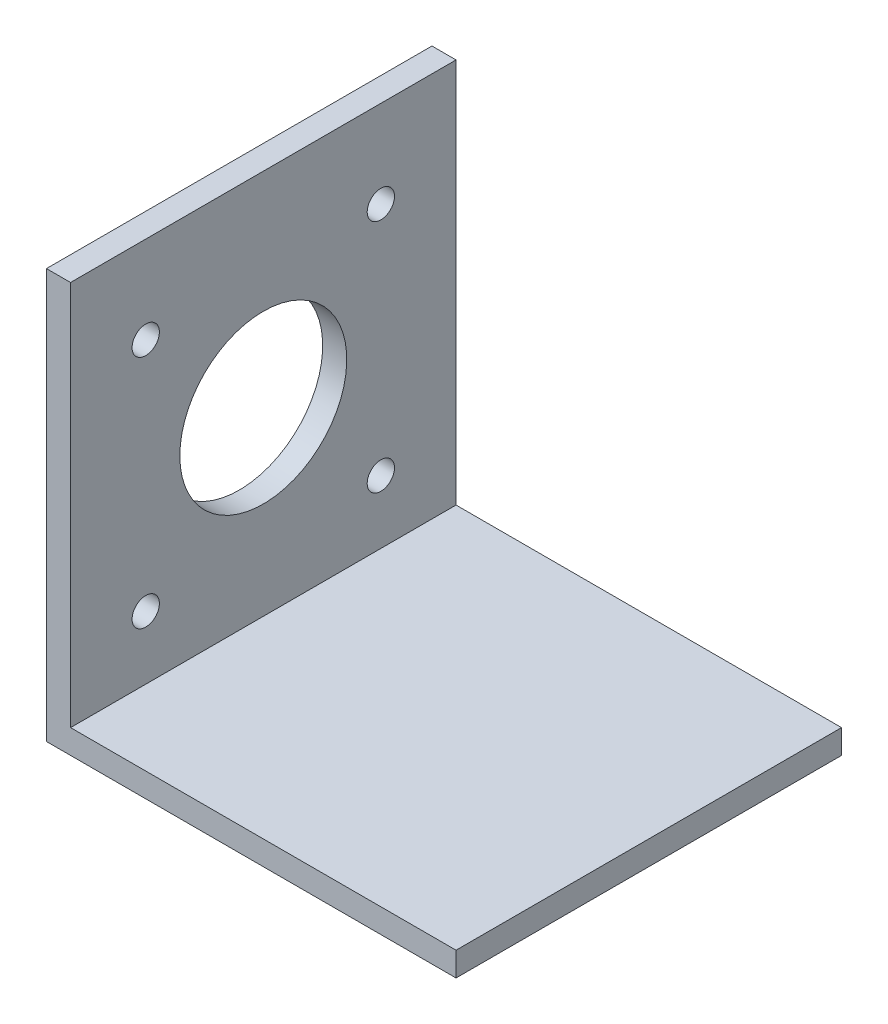
ISO-10303-21;
HEADER;
FILE_DESCRIPTION(('STEP AP214'),'2;1');
FILE_NAME('part.step','',(''),(''),'','','');
FILE_SCHEMA(('AUTOMOTIVE_DESIGN { 1 0 10303 214 1 1 1 1 }'));
ENDSEC;
DATA;
#1=APPLICATION_CONTEXT('core data for automotive mechanical design processes');
#2=APPLICATION_PROTOCOL_DEFINITION('international standard','automotive_design',2000,#1);
#3=PRODUCT_CONTEXT('',#1,'mechanical');
#4=PRODUCT('Part','Part','',(#3));
#5=PRODUCT_RELATED_PRODUCT_CATEGORY('part','',(#4));
#6=PRODUCT_DEFINITION_FORMATION('','',#4);
#7=PRODUCT_DEFINITION_CONTEXT('part definition',#1,'design');
#8=PRODUCT_DEFINITION('design','',#6,#7);
#9=PRODUCT_DEFINITION_SHAPE('','',#8);
#10=(LENGTH_UNIT() NAMED_UNIT(*) SI_UNIT(.MILLI.,.METRE.));
#11=(NAMED_UNIT(*) PLANE_ANGLE_UNIT() SI_UNIT($,.RADIAN.));
#12=(NAMED_UNIT(*) SI_UNIT($,.STERADIAN.) SOLID_ANGLE_UNIT());
#13=UNCERTAINTY_MEASURE_WITH_UNIT(LENGTH_MEASURE(1.E-05),#10,'distance_accuracy_value','');
#14=(GEOMETRIC_REPRESENTATION_CONTEXT(3) GLOBAL_UNCERTAINTY_ASSIGNED_CONTEXT((#13)) GLOBAL_UNIT_ASSIGNED_CONTEXT((#10,
#11,#12)) REPRESENTATION_CONTEXT('',''));
#15=CARTESIAN_POINT('',(0.,0.,0.));
#16=DIRECTION('',(0.,0.,1.));
#17=DIRECTION('',(1.,0.,0.));
#18=AXIS2_PLACEMENT_3D('',#15,#16,#17);
#19=CARTESIAN_POINT('',(0.,-3.175,50.8));
#20=DIRECTION('',(0.,1.,0.));
#21=DIRECTION('',(0.,0.,1.));
#22=AXIS2_PLACEMENT_3D('',#19,#20,#21);
#23=PLANE('',#22);
#24=DIRECTION('',(1.,0.,0.));
#25=VECTOR('',#24,1.);
#26=CARTESIAN_POINT('',(0.,-3.175,0.));
#27=LINE('',#26,#25);
#28=CARTESIAN_POINT('',(-3.17500000000001,-3.175,0.));
#29=VERTEX_POINT('',#28);
#30=CARTESIAN_POINT('',(50.8,-3.175,0.));
#31=VERTEX_POINT('',#30);
#32=EDGE_CURVE('E134',#29,#31,#27,.T.);
#33=ORIENTED_EDGE('',*,*,#32,.T.);
#34=DIRECTION('',(0.,0.,-1.));
#35=VECTOR('',#34,1.);
#36=CARTESIAN_POINT('',(50.8,-3.175,50.8));
#37=LINE('',#36,#35);
#38=CARTESIAN_POINT('',(50.8,-3.175,50.8));
#39=VERTEX_POINT('',#38);
#40=EDGE_CURVE('E13',#39,#31,#37,.T.);
#41=ORIENTED_EDGE('',*,*,#40,.F.);
#42=DIRECTION('',(1.,0.,0.));
#43=VECTOR('',#42,1.);
#44=CARTESIAN_POINT('',(0.,-3.175,50.8));
#45=LINE('',#44,#43);
#46=CARTESIAN_POINT('',(-3.17500000000001,-3.175,50.8));
#47=VERTEX_POINT('',#46);
#48=EDGE_CURVE('E99',#47,#39,#45,.T.);
#49=ORIENTED_EDGE('',*,*,#48,.F.);
#50=DIRECTION('',(0.,0.,-1.));
#51=VECTOR('',#50,1.);
#52=CARTESIAN_POINT('',(-3.17500000000001,-3.175,50.8));
#53=LINE('',#52,#51);
#54=EDGE_CURVE('E130',#47,#29,#53,.T.);
#55=ORIENTED_EDGE('',*,*,#54,.T.);
#56=EDGE_LOOP('',(#33,#41,#49,#55));
#57=FACE_BOUND('',#56,.T.);
#58=ADVANCED_FACE('F53',(#57),#23,.F.);
#59=CARTESIAN_POINT('',(50.8,0.,50.8));
#60=DIRECTION('',(1.,0.,0.));
#61=DIRECTION('',(0.,0.,-1.));
#62=AXIS2_PLACEMENT_3D('',#59,#60,#61);
#63=PLANE('',#62);
#64=DIRECTION('',(0.,-1.,0.));
#65=VECTOR('',#64,1.);
#66=CARTESIAN_POINT('',(50.8,0.,0.));
#67=LINE('',#66,#65);
#68=CARTESIAN_POINT('',(50.8,0.,0.));
#69=VERTEX_POINT('',#68);
#70=EDGE_CURVE('E137',#69,#31,#67,.T.);
#71=ORIENTED_EDGE('',*,*,#70,.F.);
#72=DIRECTION('',(0.,0.,-1.));
#73=VECTOR('',#72,1.);
#74=CARTESIAN_POINT('',(50.8,0.,50.8));
#75=LINE('',#74,#73);
#76=CARTESIAN_POINT('',(50.8,0.,50.8));
#77=VERTEX_POINT('',#76);
#78=EDGE_CURVE('E61',#77,#69,#75,.T.);
#79=ORIENTED_EDGE('',*,*,#78,.F.);
#80=DIRECTION('',(0.,-1.,0.));
#81=VECTOR('',#80,1.);
#82=CARTESIAN_POINT('',(50.8,0.,50.8));
#83=LINE('',#82,#81);
#84=EDGE_CURVE('E213',#77,#39,#83,.T.);
#85=ORIENTED_EDGE('',*,*,#84,.T.);
#86=ORIENTED_EDGE('',*,*,#40,.T.);
#87=EDGE_LOOP('',(#71,#79,#85,#86));
#88=FACE_BOUND('',#87,.T.);
#89=ADVANCED_FACE('F156',(#88),#63,.T.);
#90=CARTESIAN_POINT('',(0.,0.,50.8));
#91=DIRECTION('',(0.,1.,0.));
#92=DIRECTION('',(0.,0.,1.));
#93=AXIS2_PLACEMENT_3D('',#90,#91,#92);
#94=PLANE('',#93);
#95=DIRECTION('',(1.,0.,0.));
#96=VECTOR('',#95,1.);
#97=CARTESIAN_POINT('',(0.,0.,0.));
#98=LINE('',#97,#96);
#99=CARTESIAN_POINT('',(0.,0.,0.));
#100=VERTEX_POINT('',#99);
#101=EDGE_CURVE('E141',#100,#69,#98,.T.);
#102=ORIENTED_EDGE('',*,*,#101,.F.);
#103=DIRECTION('',(0.,0.,-1.));
#104=VECTOR('',#103,1.);
#105=CARTESIAN_POINT('',(0.,0.,50.8));
#106=LINE('',#105,#104);
#107=CARTESIAN_POINT('',(0.,0.,50.8));
#108=VERTEX_POINT('',#107);
#109=EDGE_CURVE('E120',#108,#100,#106,.T.);
#110=ORIENTED_EDGE('',*,*,#109,.F.);
#111=DIRECTION('',(1.,0.,0.));
#112=VECTOR('',#111,1.);
#113=CARTESIAN_POINT('',(0.,0.,50.8));
#114=LINE('',#113,#112);
#115=EDGE_CURVE('E126',#108,#77,#114,.T.);
#116=ORIENTED_EDGE('',*,*,#115,.T.);
#117=ORIENTED_EDGE('',*,*,#78,.T.);
#118=EDGE_LOOP('',(#102,#110,#116,#117));
#119=FACE_BOUND('',#118,.T.);
#120=ADVANCED_FACE('F153',(#119),#94,.T.);
#121=CARTESIAN_POINT('',(0.,50.8,50.8));
#122=DIRECTION('',(1.,0.,0.));
#123=DIRECTION('',(0.,1.,0.));
#124=AXIS2_PLACEMENT_3D('',#121,#122,#123);
#125=PLANE('',#124);
#126=CARTESIAN_POINT('',(0.,39.3034418088443,9.90905819115571));
#127=DIRECTION('',(1.,0.,0.));
#128=DIRECTION('',(0.,1.,0.));
#129=AXIS2_PLACEMENT_3D('',#126,#127,#128);
#130=CIRCLE('',#129,1.79999999999999);
#131=CARTESIAN_POINT('',(0.,41.1034418088443,9.90905819115571));
#132=VERTEX_POINT('',#131);
#133=EDGE_CURVE('E190',#132,#132,#130,.T.);
#134=ORIENTED_EDGE('',*,*,#133,.F.);
#135=EDGE_LOOP('',(#134));
#136=FACE_BOUND('',#135,.T.);
#137=CARTESIAN_POINT('',(0.,39.3034418088443,40.8909418088443));
#138=DIRECTION('',(1.,0.,0.));
#139=DIRECTION('',(0.,1.,0.));
#140=AXIS2_PLACEMENT_3D('',#137,#138,#139);
#141=CIRCLE('',#140,1.79999999999999);
#142=CARTESIAN_POINT('',(0.,41.1034418088443,40.8909418088443));
#143=VERTEX_POINT('',#142);
#144=EDGE_CURVE('E194',#143,#143,#141,.T.);
#145=ORIENTED_EDGE('',*,*,#144,.F.);
#146=EDGE_LOOP('',(#145));
#147=FACE_BOUND('',#146,.T.);
#148=CARTESIAN_POINT('',(0.,8.32155819115572,40.8909418088443));
#149=DIRECTION('',(1.,0.,0.));
#150=DIRECTION('',(0.,1.,0.));
#151=AXIS2_PLACEMENT_3D('',#148,#149,#150);
#152=CIRCLE('',#151,1.79999999999999);
#153=CARTESIAN_POINT('',(0.,10.1215581911557,40.8909418088443));
#154=VERTEX_POINT('',#153);
#155=EDGE_CURVE('E198',#154,#154,#152,.T.);
#156=ORIENTED_EDGE('',*,*,#155,.F.);
#157=EDGE_LOOP('',(#156));
#158=FACE_BOUND('',#157,.T.);
#159=CARTESIAN_POINT('',(0.,8.32155819115572,9.90905819115572));
#160=DIRECTION('',(1.,0.,0.));
#161=DIRECTION('',(0.,1.,0.));
#162=AXIS2_PLACEMENT_3D('',#159,#160,#161);
#163=CIRCLE('',#162,1.79999999999999);
#164=CARTESIAN_POINT('',(0.,10.1215581911557,9.90905819115572));
#165=VERTEX_POINT('',#164);
#166=EDGE_CURVE('E202',#165,#165,#163,.T.);
#167=ORIENTED_EDGE('',*,*,#166,.F.);
#168=EDGE_LOOP('',(#167));
#169=FACE_BOUND('',#168,.T.);
#170=CARTESIAN_POINT('',(0.,23.8125,25.4));
#171=DIRECTION('',(1.,0.,0.));
#172=DIRECTION('',(0.,1.,0.));
#173=AXIS2_PLACEMENT_3D('',#170,#171,#172);
#174=CIRCLE('',#173,11.);
#175=CARTESIAN_POINT('',(0.,34.8125,25.4));
#176=VERTEX_POINT('',#175);
#177=EDGE_CURVE('E138',#176,#176,#174,.T.);
#178=ORIENTED_EDGE('',*,*,#177,.F.);
#179=EDGE_LOOP('',(#178));
#180=FACE_BOUND('',#179,.T.);
#181=DIRECTION('',(0.,-1.,0.));
#182=VECTOR('',#181,1.);
#183=CARTESIAN_POINT('',(0.,50.8,0.));
#184=LINE('',#183,#182);
#185=CARTESIAN_POINT('',(0.,50.8,0.));
#186=VERTEX_POINT('',#185);
#187=EDGE_CURVE('E115',#186,#100,#184,.T.);
#188=ORIENTED_EDGE('',*,*,#187,.F.);
#189=DIRECTION('',(0.,0.,-1.));
#190=VECTOR('',#189,1.);
#191=CARTESIAN_POINT('',(0.,50.8,50.8));
#192=LINE('',#191,#190);
#193=CARTESIAN_POINT('',(0.,50.8,50.8));
#194=VERTEX_POINT('',#193);
#195=EDGE_CURVE('E110',#194,#186,#192,.T.);
#196=ORIENTED_EDGE('',*,*,#195,.F.);
#197=DIRECTION('',(0.,-1.,0.));
#198=VECTOR('',#197,1.);
#199=CARTESIAN_POINT('',(0.,50.8,50.8));
#200=LINE('',#199,#198);
#201=EDGE_CURVE('E113',#194,#108,#200,.T.);
#202=ORIENTED_EDGE('',*,*,#201,.T.);
#203=ORIENTED_EDGE('',*,*,#109,.T.);
#204=EDGE_LOOP('',(#188,#196,#202,#203));
#205=FACE_BOUND('',#204,.T.);
#206=ADVANCED_FACE('F112',(#136,#147,#158,#169,#180,#205),#125,.T.);
#207=CARTESIAN_POINT('',(-3.17499999999998,50.8,50.8));
#208=DIRECTION('',(0.,1.,0.));
#209=DIRECTION('',(0.,0.,1.));
#210=AXIS2_PLACEMENT_3D('',#207,#208,#209);
#211=PLANE('',#210);
#212=DIRECTION('',(1.,0.,0.));
#213=VECTOR('',#212,1.);
#214=CARTESIAN_POINT('',(-3.17499999999998,50.8,0.));
#215=LINE('',#214,#213);
#216=CARTESIAN_POINT('',(-3.17499999999998,50.8,0.));
#217=VERTEX_POINT('',#216);
#218=EDGE_CURVE('E145',#217,#186,#215,.T.);
#219=ORIENTED_EDGE('',*,*,#218,.F.);
#220=DIRECTION('',(0.,0.,-1.));
#221=VECTOR('',#220,1.);
#222=CARTESIAN_POINT('',(-3.17499999999998,50.8,50.8));
#223=LINE('',#222,#221);
#224=CARTESIAN_POINT('',(-3.17499999999998,50.8,50.8));
#225=VERTEX_POINT('',#224);
#226=EDGE_CURVE('E90',#225,#217,#223,.T.);
#227=ORIENTED_EDGE('',*,*,#226,.F.);
#228=DIRECTION('',(1.,0.,0.));
#229=VECTOR('',#228,1.);
#230=CARTESIAN_POINT('',(-3.17499999999998,50.8,50.8));
#231=LINE('',#230,#229);
#232=EDGE_CURVE('E124',#225,#194,#231,.T.);
#233=ORIENTED_EDGE('',*,*,#232,.T.);
#234=ORIENTED_EDGE('',*,*,#195,.T.);
#235=EDGE_LOOP('',(#219,#227,#233,#234));
#236=FACE_BOUND('',#235,.T.);
#237=ADVANCED_FACE('F128',(#236),#211,.T.);
#238=CARTESIAN_POINT('',(-3.17499999999998,50.8,50.8));
#239=DIRECTION('',(1.,0.,0.));
#240=DIRECTION('',(0.,1.,0.));
#241=AXIS2_PLACEMENT_3D('',#238,#239,#240);
#242=PLANE('',#241);
#243=CARTESIAN_POINT('',(-3.17499999999998,39.3034418088443,9.90905819115571));
#244=DIRECTION('',(-1.,0.,0.));
#245=DIRECTION('',(0.,0.,1.));
#246=AXIS2_PLACEMENT_3D('',#243,#244,#245);
#247=CIRCLE('',#246,1.8);
#248=CARTESIAN_POINT('',(-3.17499999999998,39.3034418088443,11.7090581911557));
#249=VERTEX_POINT('',#248);
#250=EDGE_CURVE('E227',#249,#249,#247,.T.);
#251=ORIENTED_EDGE('',*,*,#250,.F.);
#252=EDGE_LOOP('',(#251));
#253=FACE_BOUND('',#252,.T.);
#254=CARTESIAN_POINT('',(-3.17499999999998,39.3034418088443,40.8909418088443));
#255=DIRECTION('',(-1.,0.,0.));
#256=DIRECTION('',(0.,0.,1.));
#257=AXIS2_PLACEMENT_3D('',#254,#255,#256);
#258=CIRCLE('',#257,1.8);
#259=CARTESIAN_POINT('',(-3.17499999999998,39.3034418088443,42.6909418088443));
#260=VERTEX_POINT('',#259);
#261=EDGE_CURVE('E223',#260,#260,#258,.T.);
#262=ORIENTED_EDGE('',*,*,#261,.F.);
#263=EDGE_LOOP('',(#262));
#264=FACE_BOUND('',#263,.T.);
#265=CARTESIAN_POINT('',(-3.17500000000001,8.32155819115572,40.8909418088443));
#266=DIRECTION('',(-1.,0.,0.));
#267=DIRECTION('',(0.,0.,1.));
#268=AXIS2_PLACEMENT_3D('',#265,#266,#267);
#269=CIRCLE('',#268,1.8);
#270=CARTESIAN_POINT('',(-3.17500000000001,8.32155819115572,42.6909418088443));
#271=VERTEX_POINT('',#270);
#272=EDGE_CURVE('E219',#271,#271,#269,.T.);
#273=ORIENTED_EDGE('',*,*,#272,.F.);
#274=EDGE_LOOP('',(#273));
#275=FACE_BOUND('',#274,.T.);
#276=CARTESIAN_POINT('',(-3.17500000000001,8.32155819115572,9.90905819115572));
#277=DIRECTION('',(-1.,0.,0.));
#278=DIRECTION('',(0.,0.,1.));
#279=AXIS2_PLACEMENT_3D('',#276,#277,#278);
#280=CIRCLE('',#279,1.8);
#281=CARTESIAN_POINT('',(-3.17500000000001,8.32155819115572,11.7090581911557));
#282=VERTEX_POINT('',#281);
#283=EDGE_CURVE('E215',#282,#282,#280,.T.);
#284=ORIENTED_EDGE('',*,*,#283,.F.);
#285=EDGE_LOOP('',(#284));
#286=FACE_BOUND('',#285,.T.);
#287=CARTESIAN_POINT('',(-3.17500000000001,23.8125,25.4));
#288=DIRECTION('',(-1.,0.,0.));
#289=DIRECTION('',(0.,0.,1.));
#290=AXIS2_PLACEMENT_3D('',#287,#288,#289);
#291=CIRCLE('',#290,11.);
#292=CARTESIAN_POINT('',(-3.17500000000001,23.8125,36.4));
#293=VERTEX_POINT('',#292);
#294=EDGE_CURVE('E206',#293,#293,#291,.T.);
#295=ORIENTED_EDGE('',*,*,#294,.F.);
#296=EDGE_LOOP('',(#295));
#297=FACE_BOUND('',#296,.T.);
#298=DIRECTION('',(0.,-1.,0.));
#299=VECTOR('',#298,1.);
#300=CARTESIAN_POINT('',(-3.17499999999998,50.8,0.));
#301=LINE('',#300,#299);
#302=EDGE_CURVE('E93',#217,#29,#301,.T.);
#303=ORIENTED_EDGE('',*,*,#302,.T.);
#304=ORIENTED_EDGE('',*,*,#54,.F.);
#305=DIRECTION('',(0.,-1.,0.));
#306=VECTOR('',#305,1.);
#307=CARTESIAN_POINT('',(-3.17499999999998,50.8,50.8));
#308=LINE('',#307,#306);
#309=EDGE_CURVE('E69',#225,#47,#308,.T.);
#310=ORIENTED_EDGE('',*,*,#309,.F.);
#311=ORIENTED_EDGE('',*,*,#226,.T.);
#312=EDGE_LOOP('',(#303,#304,#310,#311));
#313=FACE_BOUND('',#312,.T.);
#314=ADVANCED_FACE('F161',(#253,#264,#275,#286,#297,#313),#242,.F.);
#315=CARTESIAN_POINT('',(0.,0.,50.8));
#316=DIRECTION('',(0.,0.,-1.));
#317=DIRECTION('',(-1.,0.,0.));
#318=AXIS2_PLACEMENT_3D('',#315,#316,#317);
#319=PLANE('',#318);
#320=ORIENTED_EDGE('',*,*,#48,.T.);
#321=ORIENTED_EDGE('',*,*,#84,.F.);
#322=ORIENTED_EDGE('',*,*,#115,.F.);
#323=ORIENTED_EDGE('',*,*,#201,.F.);
#324=ORIENTED_EDGE('',*,*,#232,.F.);
#325=ORIENTED_EDGE('',*,*,#309,.T.);
#326=EDGE_LOOP('',(#320,#321,#322,#323,#324,#325));
#327=FACE_BOUND('',#326,.T.);
#328=ADVANCED_FACE('F123',(#327),#319,.F.);
#329=CARTESIAN_POINT('',(0.,0.,0.));
#330=DIRECTION('',(0.,0.,-1.));
#331=DIRECTION('',(-1.,0.,0.));
#332=AXIS2_PLACEMENT_3D('',#329,#330,#331);
#333=PLANE('',#332);
#334=ORIENTED_EDGE('',*,*,#32,.F.);
#335=ORIENTED_EDGE('',*,*,#302,.F.);
#336=ORIENTED_EDGE('',*,*,#218,.T.);
#337=ORIENTED_EDGE('',*,*,#187,.T.);
#338=ORIENTED_EDGE('',*,*,#101,.T.);
#339=ORIENTED_EDGE('',*,*,#70,.T.);
#340=EDGE_LOOP('',(#334,#335,#336,#337,#338,#339));
#341=FACE_BOUND('',#340,.T.);
#342=ADVANCED_FACE('F159',(#341),#333,.T.);
#343=CARTESIAN_POINT('',(50.8,23.8125,25.4));
#344=DIRECTION('',(-1.,0.,0.));
#345=DIRECTION('',(0.,0.,1.));
#346=AXIS2_PLACEMENT_3D('',#343,#344,#345);
#347=CYLINDRICAL_SURFACE('',#346,11.);
#348=ORIENTED_EDGE('',*,*,#177,.T.);
#349=EDGE_LOOP('',(#348));
#350=FACE_BOUND('',#349,.T.);
#351=ORIENTED_EDGE('',*,*,#294,.T.);
#352=EDGE_LOOP('',(#351));
#353=FACE_BOUND('',#352,.T.);
#354=ADVANCED_FACE('F248',(#350,#353),#347,.F.);
#355=CARTESIAN_POINT('',(-3.17500000000001,8.32155819115572,9.90905819115572));
#356=DIRECTION('',(-1.,0.,0.));
#357=DIRECTION('',(0.,0.,1.));
#358=AXIS2_PLACEMENT_3D('',#355,#356,#357);
#359=CYLINDRICAL_SURFACE('',#358,1.79999999999999);
#360=ORIENTED_EDGE('',*,*,#166,.T.);
#361=EDGE_LOOP('',(#360));
#362=FACE_BOUND('',#361,.T.);
#363=ORIENTED_EDGE('',*,*,#283,.T.);
#364=EDGE_LOOP('',(#363));
#365=FACE_BOUND('',#364,.T.);
#366=ADVANCED_FACE('F244',(#362,#365),#359,.F.);
#367=CARTESIAN_POINT('',(-3.17500000000001,8.32155819115572,40.8909418088443));
#368=DIRECTION('',(-1.,0.,0.));
#369=DIRECTION('',(0.,0.,1.));
#370=AXIS2_PLACEMENT_3D('',#367,#368,#369);
#371=CYLINDRICAL_SURFACE('',#370,1.79999999999999);
#372=ORIENTED_EDGE('',*,*,#155,.T.);
#373=EDGE_LOOP('',(#372));
#374=FACE_BOUND('',#373,.T.);
#375=ORIENTED_EDGE('',*,*,#272,.T.);
#376=EDGE_LOOP('',(#375));
#377=FACE_BOUND('',#376,.T.);
#378=ADVANCED_FACE('F238',(#374,#377),#371,.F.);
#379=CARTESIAN_POINT('',(-3.17499999999998,39.3034418088443,40.8909418088443));
#380=DIRECTION('',(-1.,0.,0.));
#381=DIRECTION('',(0.,0.,1.));
#382=AXIS2_PLACEMENT_3D('',#379,#380,#381);
#383=CYLINDRICAL_SURFACE('',#382,1.79999999999999);
#384=ORIENTED_EDGE('',*,*,#144,.T.);
#385=EDGE_LOOP('',(#384));
#386=FACE_BOUND('',#385,.T.);
#387=ORIENTED_EDGE('',*,*,#261,.T.);
#388=EDGE_LOOP('',(#387));
#389=FACE_BOUND('',#388,.T.);
#390=ADVANCED_FACE('F232',(#386,#389),#383,.F.);
#391=CARTESIAN_POINT('',(-3.17499999999998,39.3034418088443,9.90905819115571));
#392=DIRECTION('',(-1.,0.,0.));
#393=DIRECTION('',(0.,0.,1.));
#394=AXIS2_PLACEMENT_3D('',#391,#392,#393);
#395=CYLINDRICAL_SURFACE('',#394,1.79999999999999);
#396=ORIENTED_EDGE('',*,*,#133,.T.);
#397=EDGE_LOOP('',(#396));
#398=FACE_BOUND('',#397,.T.);
#399=ORIENTED_EDGE('',*,*,#250,.T.);
#400=EDGE_LOOP('',(#399));
#401=FACE_BOUND('',#400,.T.);
#402=ADVANCED_FACE('F230',(#398,#401),#395,.F.);
#403=CLOSED_SHELL('',(#58,#89,#120,#206,#237,#314,#328,#342,#354,#366,#378,#390,#402));
#404=MANIFOLD_SOLID_BREP('B2',#403);
#405=ADVANCED_BREP_SHAPE_REPRESENTATION('',(#18,#404),#14);
#406=SHAPE_DEFINITION_REPRESENTATION(#9,#405);
ENDSEC;
END-ISO-10303-21;
